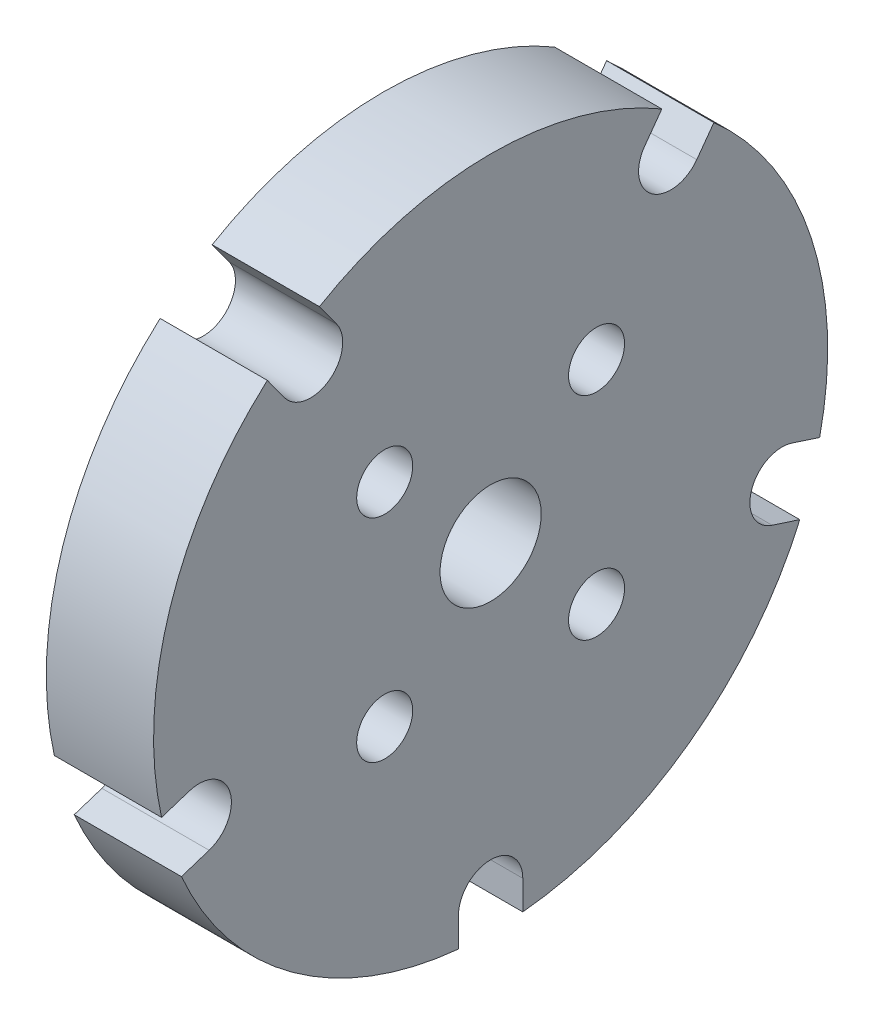
ISO-10303-21;
HEADER;
FILE_DESCRIPTION(('STEP AP214'),'2;1');
FILE_NAME('part.step','',(''),(''),'','','');
FILE_SCHEMA(('AUTOMOTIVE_DESIGN { 1 0 10303 214 1 1 1 1 }'));
ENDSEC;
DATA;
#1=APPLICATION_CONTEXT('core data for automotive mechanical design processes');
#2=APPLICATION_PROTOCOL_DEFINITION('international standard','automotive_design',2000,#1);
#3=PRODUCT_CONTEXT('',#1,'mechanical');
#4=PRODUCT('Part','Part','',(#3));
#5=PRODUCT_RELATED_PRODUCT_CATEGORY('part','',(#4));
#6=PRODUCT_DEFINITION_FORMATION('','',#4);
#7=PRODUCT_DEFINITION_CONTEXT('part definition',#1,'design');
#8=PRODUCT_DEFINITION('design','',#6,#7);
#9=PRODUCT_DEFINITION_SHAPE('','',#8);
#10=(LENGTH_UNIT() NAMED_UNIT(*) SI_UNIT(.MILLI.,.METRE.));
#11=(NAMED_UNIT(*) PLANE_ANGLE_UNIT() SI_UNIT($,.RADIAN.));
#12=(NAMED_UNIT(*) SI_UNIT($,.STERADIAN.) SOLID_ANGLE_UNIT());
#13=UNCERTAINTY_MEASURE_WITH_UNIT(LENGTH_MEASURE(1.E-05),#10,'distance_accuracy_value','');
#14=(GEOMETRIC_REPRESENTATION_CONTEXT(3) GLOBAL_UNCERTAINTY_ASSIGNED_CONTEXT((#13)) GLOBAL_UNIT_ASSIGNED_CONTEXT((#10,
#11,#12)) REPRESENTATION_CONTEXT('',''));
#15=CARTESIAN_POINT('',(0.,0.,0.));
#16=DIRECTION('',(0.,0.,1.));
#17=DIRECTION('',(1.,0.,0.));
#18=AXIS2_PLACEMENT_3D('',#15,#16,#17);
#19=CARTESIAN_POINT('',(7.,0.,0.));
#20=DIRECTION('',(-1.,0.,0.));
#21=DIRECTION('',(0.,0.,1.));
#22=AXIS2_PLACEMENT_3D('',#19,#20,#21);
#23=CYLINDRICAL_SURFACE('',#22,22.);
#24=CARTESIAN_POINT('',(7.,0.,0.));
#25=DIRECTION('',(1.,0.,0.));
#26=DIRECTION('',(0.,0.,-1.));
#27=AXIS2_PLACEMENT_3D('',#24,#25,#26);
#28=CIRCLE('',#27,22.);
#29=CARTESIAN_POINT('',(7.,-4.77011238747001,-21.476639118142));
#30=VERTEX_POINT('',#29);
#31=CARTESIAN_POINT('',(7.,16.4827537289933,-14.571164315502));
#32=VERTEX_POINT('',#31);
#33=EDGE_CURVE('E42',#30,#32,#28,.T.);
#34=ORIENTED_EDGE('',*,*,#33,.F.);
#35=DIRECTION('',(-1.,0.,0.));
#36=VECTOR('',#35,1.);
#37=CARTESIAN_POINT('',(7.,-4.77011238747001,-21.476639118142));
#38=LINE('',#37,#36);
#39=CARTESIAN_POINT('',(0.,-4.77011238747001,-21.476639118142));
#40=VERTEX_POINT('',#39);
#41=EDGE_CURVE('E191',#40,#30,#38,.F.);
#42=ORIENTED_EDGE('',*,*,#41,.F.);
#43=CARTESIAN_POINT('',(0.,0.,0.));
#44=DIRECTION('',(1.,0.,0.));
#45=DIRECTION('',(0.,0.,-1.));
#46=AXIS2_PLACEMENT_3D('',#43,#44,#45);
#47=CIRCLE('',#46,22.);
#48=CARTESIAN_POINT('',(0.,16.4827537289933,-14.571164315502));
#49=VERTEX_POINT('',#48);
#50=EDGE_CURVE('E228',#40,#49,#47,.T.);
#51=ORIENTED_EDGE('',*,*,#50,.T.);
#52=DIRECTION('',(-1.,0.,0.));
#53=VECTOR('',#52,1.);
#54=CARTESIAN_POINT('',(7.,16.4827537289933,-14.571164315502));
#55=LINE('',#54,#53);
#56=EDGE_CURVE('E253',#32,#49,#55,.T.);
#57=ORIENTED_EDGE('',*,*,#56,.F.);
#58=EDGE_LOOP('',(#34,#42,#51,#57));
#59=FACE_BOUND('',#58,.T.);
#60=ADVANCED_FACE('F33',(#59),#23,.T.);
#61=CARTESIAN_POINT('',(7.,18.9514517886216,-11.1732929391272));
#62=VERTEX_POINT('',#61);
#63=CARTESIAN_POINT('',(7.,18.9514517886215,11.1732929391275));
#64=VERTEX_POINT('',#63);
#65=EDGE_CURVE('E340',#62,#64,#28,.T.);
#66=ORIENTED_EDGE('',*,*,#65,.F.);
#67=DIRECTION('',(-1.,0.,0.));
#68=VECTOR('',#67,1.);
#69=CARTESIAN_POINT('',(7.,18.9514517886216,-11.1732929391272));
#70=LINE('',#69,#68);
#71=CARTESIAN_POINT('',(0.,18.9514517886217,-11.1732929391272));
#72=VERTEX_POINT('',#71);
#73=EDGE_CURVE('E242',#72,#62,#70,.F.);
#74=ORIENTED_EDGE('',*,*,#73,.F.);
#75=CARTESIAN_POINT('',(0.,18.9514517886215,11.1732929391275));
#76=VERTEX_POINT('',#75);
#77=EDGE_CURVE('E227',#72,#76,#47,.T.);
#78=ORIENTED_EDGE('',*,*,#77,.T.);
#79=DIRECTION('',(-1.,0.,0.));
#80=VECTOR('',#79,1.);
#81=CARTESIAN_POINT('',(7.,18.9514517886215,11.1732929391275));
#82=LINE('',#81,#80);
#83=EDGE_CURVE('E58',#64,#76,#82,.T.);
#84=ORIENTED_EDGE('',*,*,#83,.F.);
#85=EDGE_LOOP('',(#66,#74,#78,#84));
#86=FACE_BOUND('',#85,.T.);
#87=ADVANCED_FACE('F240',(#86),#23,.T.);
#88=CARTESIAN_POINT('',(7.,16.4827537289931,14.5711643155022));
#89=VERTEX_POINT('',#88);
#90=CARTESIAN_POINT('',(7.,-4.77011238747031,21.4766391181419));
#91=VERTEX_POINT('',#90);
#92=EDGE_CURVE('E229',#89,#91,#28,.T.);
#93=ORIENTED_EDGE('',*,*,#92,.F.);
#94=DIRECTION('',(-1.,0.,0.));
#95=VECTOR('',#94,1.);
#96=CARTESIAN_POINT('',(7.,16.4827537289931,14.5711643155022));
#97=LINE('',#96,#95);
#98=CARTESIAN_POINT('',(0.,16.4827537289931,14.5711643155022));
#99=VERTEX_POINT('',#98);
#100=EDGE_CURVE('E336',#99,#89,#97,.F.);
#101=ORIENTED_EDGE('',*,*,#100,.F.);
#102=CARTESIAN_POINT('',(0.,-4.77011238747031,21.4766391181419));
#103=VERTEX_POINT('',#102);
#104=EDGE_CURVE('E221',#99,#103,#47,.T.);
#105=ORIENTED_EDGE('',*,*,#104,.T.);
#106=DIRECTION('',(-1.,0.,0.));
#107=VECTOR('',#106,1.);
#108=CARTESIAN_POINT('',(7.,-4.77011238747031,21.4766391181419));
#109=LINE('',#108,#107);
#110=EDGE_CURVE('E50',#91,#103,#109,.T.);
#111=ORIENTED_EDGE('',*,*,#110,.F.);
#112=EDGE_LOOP('',(#93,#101,#105,#111));
#113=FACE_BOUND('',#112,.T.);
#114=ADVANCED_FACE('F318',(#113),#23,.T.);
#115=CARTESIAN_POINT('',(7.,-8.76454975590994,20.1787677417671));
#116=VERTEX_POINT('',#115);
#117=CARTESIAN_POINT('',(7.,-21.899543374235,2.1));
#118=VERTEX_POINT('',#117);
#119=EDGE_CURVE('E43',#116,#118,#28,.T.);
#120=ORIENTED_EDGE('',*,*,#119,.F.);
#121=DIRECTION('',(-1.,0.,0.));
#122=VECTOR('',#121,1.);
#123=CARTESIAN_POINT('',(7.,-8.76454975590994,20.1787677417671));
#124=LINE('',#123,#122);
#125=CARTESIAN_POINT('',(0.,-8.76454975590995,20.1787677417671));
#126=VERTEX_POINT('',#125);
#127=EDGE_CURVE('E262',#126,#116,#124,.F.);
#128=ORIENTED_EDGE('',*,*,#127,.F.);
#129=CARTESIAN_POINT('',(0.,-21.899543374235,2.1));
#130=VERTEX_POINT('',#129);
#131=EDGE_CURVE('E216',#126,#130,#47,.T.);
#132=ORIENTED_EDGE('',*,*,#131,.T.);
#133=DIRECTION('',(-1.,0.,0.));
#134=VECTOR('',#133,1.);
#135=CARTESIAN_POINT('',(7.,-21.899543374235,2.1));
#136=LINE('',#135,#134);
#137=EDGE_CURVE('E284',#118,#130,#136,.T.);
#138=ORIENTED_EDGE('',*,*,#137,.F.);
#139=EDGE_LOOP('',(#120,#128,#132,#138));
#140=FACE_BOUND('',#139,.T.);
#141=ADVANCED_FACE('F298',(#140),#23,.T.);
#142=CARTESIAN_POINT('',(0.,-21.899543374235,-2.1));
#143=VERTEX_POINT('',#142);
#144=CARTESIAN_POINT('',(0.,-8.76454975590966,-20.1787677417672));
#145=VERTEX_POINT('',#144);
#146=EDGE_CURVE('E37',#143,#145,#47,.T.);
#147=ORIENTED_EDGE('',*,*,#146,.T.);
#148=DIRECTION('',(-1.,0.,0.));
#149=VECTOR('',#148,1.);
#150=CARTESIAN_POINT('',(7.,-8.76454975590966,-20.1787677417672));
#151=LINE('',#150,#149);
#152=CARTESIAN_POINT('',(7.,-8.76454975590966,-20.1787677417672));
#153=VERTEX_POINT('',#152);
#154=EDGE_CURVE('E177',#153,#145,#151,.T.);
#155=ORIENTED_EDGE('',*,*,#154,.F.);
#156=CARTESIAN_POINT('',(7.,-21.899543374235,-2.1));
#157=VERTEX_POINT('',#156);
#158=EDGE_CURVE('E11',#157,#153,#28,.T.);
#159=ORIENTED_EDGE('',*,*,#158,.F.);
#160=DIRECTION('',(-1.,0.,0.));
#161=VECTOR('',#160,1.);
#162=CARTESIAN_POINT('',(7.,-21.899543374235,-2.1));
#163=LINE('',#162,#161);
#164=EDGE_CURVE('E286',#143,#157,#163,.F.);
#165=ORIENTED_EDGE('',*,*,#164,.F.);
#166=EDGE_LOOP('',(#147,#155,#159,#165));
#167=FACE_BOUND('',#166,.T.);
#168=ADVANCED_FACE('F35',(#167),#23,.T.);
#169=CARTESIAN_POINT('',(7.,0.,0.));
#170=DIRECTION('',(1.,0.,0.));
#171=DIRECTION('',(0.,0.,-1.));
#172=AXIS2_PLACEMENT_3D('',#169,#170,#171);
#173=PLANE('',#172);
#174=CARTESIAN_POINT('',(7.,6.91479721322325,-6.91479721322325));
#175=DIRECTION('',(-1.,0.,0.));
#176=DIRECTION('',(0.,0.,1.));
#177=AXIS2_PLACEMENT_3D('',#174,#175,#176);
#178=CIRCLE('',#177,1.8288);
#179=CARTESIAN_POINT('',(7.,6.91479721322325,-5.08599721322325));
#180=VERTEX_POINT('',#179);
#181=EDGE_CURVE('E484',#180,#180,#178,.T.);
#182=ORIENTED_EDGE('',*,*,#181,.T.);
#183=EDGE_LOOP('',(#182));
#184=FACE_BOUND('',#183,.T.);
#185=CARTESIAN_POINT('',(7.,6.91479721322325,6.91479721322325));
#186=DIRECTION('',(-1.,0.,0.));
#187=DIRECTION('',(0.,0.,1.));
#188=AXIS2_PLACEMENT_3D('',#185,#186,#187);
#189=CIRCLE('',#188,1.8288);
#190=CARTESIAN_POINT('',(7.,6.91479721322325,8.74359721322325));
#191=VERTEX_POINT('',#190);
#192=EDGE_CURVE('E496',#191,#191,#189,.T.);
#193=ORIENTED_EDGE('',*,*,#192,.T.);
#194=EDGE_LOOP('',(#193));
#195=FACE_BOUND('',#194,.T.);
#196=CARTESIAN_POINT('',(7.,-6.91479721322325,6.91479721322325));
#197=DIRECTION('',(-1.,0.,0.));
#198=DIRECTION('',(0.,0.,1.));
#199=AXIS2_PLACEMENT_3D('',#196,#197,#198);
#200=CIRCLE('',#199,1.8288);
#201=CARTESIAN_POINT('',(7.,-6.91479721322325,8.74359721322325));
#202=VERTEX_POINT('',#201);
#203=EDGE_CURVE('E508',#202,#202,#200,.T.);
#204=ORIENTED_EDGE('',*,*,#203,.T.);
#205=EDGE_LOOP('',(#204));
#206=FACE_BOUND('',#205,.T.);
#207=CARTESIAN_POINT('',(7.,-6.91479721322325,-6.91479721322325));
#208=DIRECTION('',(-1.,0.,0.));
#209=DIRECTION('',(0.,0.,1.));
#210=AXIS2_PLACEMENT_3D('',#207,#208,#209);
#211=CIRCLE('',#210,1.8288);
#212=CARTESIAN_POINT('',(7.,-6.91479721322325,-5.08599721322325));
#213=VERTEX_POINT('',#212);
#214=EDGE_CURVE('E520',#213,#213,#211,.T.);
#215=ORIENTED_EDGE('',*,*,#214,.T.);
#216=EDGE_LOOP('',(#215));
#217=FACE_BOUND('',#216,.T.);
#218=CARTESIAN_POINT('',(7.,0.,0.));
#219=DIRECTION('',(1.,0.,0.));
#220=DIRECTION('',(0.,0.,-1.));
#221=AXIS2_PLACEMENT_3D('',#218,#219,#220);
#222=CIRCLE('',#221,3.3);
#223=CARTESIAN_POINT('',(7.,0.,-3.3));
#224=VERTEX_POINT('',#223);
#225=EDGE_CURVE('E523',#224,#224,#222,.T.);
#226=ORIENTED_EDGE('',*,*,#225,.F.);
#227=EDGE_LOOP('',(#226));
#228=FACE_BOUND('',#227,.T.);
#229=DIRECTION('',(0.,0.309016994374944,0.951056516295155));
#230=VECTOR('',#229,1.);
#231=CARTESIAN_POINT('',(7.,-4.18312120327907,-19.6700660140905));
#232=LINE('',#231,#230);
#233=CARTESIAN_POINT('',(7.,-4.18312120327907,-19.6700660140905));
#234=VERTEX_POINT('',#233);
#235=EDGE_CURVE('E183',#30,#234,#232,.T.);
#236=ORIENTED_EDGE('',*,*,#235,.F.);
#237=ORIENTED_EDGE('',*,*,#33,.T.);
#238=DIRECTION('',(0.,0.809016994374951,-0.587785252292468));
#239=VECTOR('',#238,1.);
#240=CARTESIAN_POINT('',(7.,14.9459908576848,-13.4546407340368));
#241=LINE('',#240,#239);
#242=CARTESIAN_POINT('',(7.,14.9459908576848,-13.4546407340368));
#243=VERTEX_POINT('',#242);
#244=EDGE_CURVE('E346',#243,#32,#241,.T.);
#245=ORIENTED_EDGE('',*,*,#244,.F.);
#246=CARTESIAN_POINT('',(7.,16.180339887499,-11.7557050458494));
#247=DIRECTION('',(1.,0.,0.));
#248=DIRECTION('',(0.,0.587785252292469,0.809016994374951));
#249=AXIS2_PLACEMENT_3D('',#246,#247,#248);
#250=CIRCLE('',#249,2.1);
#251=CARTESIAN_POINT('',(7.,17.4146889173132,-10.056769357662));
#252=VERTEX_POINT('',#251);
#253=EDGE_CURVE('E543',#252,#243,#250,.T.);
#254=ORIENTED_EDGE('',*,*,#253,.F.);
#255=DIRECTION('',(0.,-0.809016994374951,0.587785252292468));
#256=VECTOR('',#255,1.);
#257=CARTESIAN_POINT('',(7.,17.4146889173132,-10.056769357662));
#258=LINE('',#257,#256);
#259=EDGE_CURVE('E547',#62,#252,#258,.T.);
#260=ORIENTED_EDGE('',*,*,#259,.F.);
#261=ORIENTED_EDGE('',*,*,#65,.T.);
#262=DIRECTION('',(0.,0.809016994374942,0.58778525229248));
#263=VECTOR('',#262,1.);
#264=CARTESIAN_POINT('',(7.,17.4146889173131,10.0567693576622));
#265=LINE('',#264,#263);
#266=CARTESIAN_POINT('',(7.,17.4146889173131,10.0567693576622));
#267=VERTEX_POINT('',#266);
#268=EDGE_CURVE('E369',#267,#64,#265,.T.);
#269=ORIENTED_EDGE('',*,*,#268,.F.);
#270=CARTESIAN_POINT('',(7.,16.1803398874988,11.7557050458496));
#271=DIRECTION('',(1.,0.,0.));
#272=DIRECTION('',(0.,-0.58778525229248,0.809016994374942));
#273=AXIS2_PLACEMENT_3D('',#270,#271,#272);
#274=CIRCLE('',#273,2.1);
#275=CARTESIAN_POINT('',(7.,14.9459908576846,13.454640734037));
#276=VERTEX_POINT('',#275);
#277=EDGE_CURVE('E366',#276,#267,#274,.T.);
#278=ORIENTED_EDGE('',*,*,#277,.F.);
#279=DIRECTION('',(0.,-0.809016994374942,-0.587785252292481));
#280=VECTOR('',#279,1.);
#281=CARTESIAN_POINT('',(7.,14.9459908576846,13.454640734037));
#282=LINE('',#281,#280);
#283=EDGE_CURVE('E371',#89,#276,#282,.T.);
#284=ORIENTED_EDGE('',*,*,#283,.F.);
#285=ORIENTED_EDGE('',*,*,#92,.T.);
#286=DIRECTION('',(0.,-0.309016994374958,0.95105651629515));
#287=VECTOR('',#286,1.);
#288=CARTESIAN_POINT('',(7.,-4.18312120327935,19.6700660140904));
#289=LINE('',#288,#287);
#290=CARTESIAN_POINT('',(7.,-4.18312120327935,19.6700660140904));
#291=VERTEX_POINT('',#290);
#292=EDGE_CURVE('E273',#291,#91,#289,.T.);
#293=ORIENTED_EDGE('',*,*,#292,.F.);
#294=CARTESIAN_POINT('',(7.,-6.18033988749916,19.021130325903));
#295=DIRECTION('',(1.,0.,0.));
#296=DIRECTION('',(0.,-0.95105651629515,-0.309016994374958));
#297=AXIS2_PLACEMENT_3D('',#294,#295,#296);
#298=CIRCLE('',#297,2.1);
#299=CARTESIAN_POINT('',(7.,-8.17755857171898,18.3721946377156));
#300=VERTEX_POINT('',#299);
#301=EDGE_CURVE('E270',#300,#291,#298,.T.);
#302=ORIENTED_EDGE('',*,*,#301,.F.);
#303=DIRECTION('',(0.,0.309016994374959,-0.95105651629515));
#304=VECTOR('',#303,1.);
#305=CARTESIAN_POINT('',(7.,-8.17755857171898,18.3721946377156));
#306=LINE('',#305,#304);
#307=EDGE_CURVE('E275',#116,#300,#306,.T.);
#308=ORIENTED_EDGE('',*,*,#307,.F.);
#309=ORIENTED_EDGE('',*,*,#119,.T.);
#310=DIRECTION('',(0.,-1.,0.));
#311=VECTOR('',#310,1.);
#312=CARTESIAN_POINT('',(7.,-20.,2.1));
#313=LINE('',#312,#311);
#314=CARTESIAN_POINT('',(7.,-20.,2.1));
#315=VERTEX_POINT('',#314);
#316=EDGE_CURVE('E205',#315,#118,#313,.T.);
#317=ORIENTED_EDGE('',*,*,#316,.F.);
#318=CARTESIAN_POINT('',(7.,-20.,0.));
#319=DIRECTION('',(1.,0.,0.));
#320=DIRECTION('',(0.,0.,-1.));
#321=AXIS2_PLACEMENT_3D('',#318,#319,#320);
#322=CIRCLE('',#321,2.1);
#323=CARTESIAN_POINT('',(7.,-20.,-2.1));
#324=VERTEX_POINT('',#323);
#325=EDGE_CURVE('E202',#324,#315,#322,.T.);
#326=ORIENTED_EDGE('',*,*,#325,.F.);
#327=DIRECTION('',(0.,1.,0.));
#328=VECTOR('',#327,1.);
#329=CARTESIAN_POINT('',(7.,-20.,-2.1));
#330=LINE('',#329,#328);
#331=EDGE_CURVE('E199',#157,#324,#330,.T.);
#332=ORIENTED_EDGE('',*,*,#331,.F.);
#333=ORIENTED_EDGE('',*,*,#158,.T.);
#334=DIRECTION('',(0.,-0.309016994374945,-0.951056516295155));
#335=VECTOR('',#334,1.);
#336=CARTESIAN_POINT('',(7.,-8.17755857171872,-18.3721946377157));
#337=LINE('',#336,#335);
#338=CARTESIAN_POINT('',(7.,-8.17755857171872,-18.3721946377157));
#339=VERTEX_POINT('',#338);
#340=EDGE_CURVE('E173',#339,#153,#337,.T.);
#341=ORIENTED_EDGE('',*,*,#340,.F.);
#342=CARTESIAN_POINT('',(7.,-6.1803398874989,-19.0211303259031));
#343=DIRECTION('',(1.,0.,0.));
#344=DIRECTION('',(0.,0.951056516295155,-0.309016994374945));
#345=AXIS2_PLACEMENT_3D('',#342,#343,#344);
#346=CIRCLE('',#345,2.1);
#347=EDGE_CURVE('E184',#234,#339,#346,.T.);
#348=ORIENTED_EDGE('',*,*,#347,.F.);
#349=EDGE_LOOP('',(#236,#237,#245,#254,#260,#261,#269,#278,#284,#285,#293,#302,#308,#309,#317,
#326,#332,#333,#341,#348));
#350=FACE_BOUND('',#349,.T.);
#351=ADVANCED_FACE('F196',(#184,#195,#206,#217,#228,#350),#173,.T.);
#352=CARTESIAN_POINT('',(0.,0.,0.));
#353=DIRECTION('',(1.,0.,0.));
#354=DIRECTION('',(0.,0.,-1.));
#355=AXIS2_PLACEMENT_3D('',#352,#353,#354);
#356=PLANE('',#355);
#357=CARTESIAN_POINT('',(0.,6.91479721322325,-6.91479721322325));
#358=DIRECTION('',(-1.,0.,0.));
#359=DIRECTION('',(0.,0.,1.));
#360=AXIS2_PLACEMENT_3D('',#357,#358,#359);
#361=CIRCLE('',#360,3.77063);
#362=CARTESIAN_POINT('',(0.,6.91479721322325,-3.14416721322325));
#363=VERTEX_POINT('',#362);
#364=EDGE_CURVE('E476',#363,#363,#361,.T.);
#365=ORIENTED_EDGE('',*,*,#364,.F.);
#366=EDGE_LOOP('',(#365));
#367=FACE_BOUND('',#366,.T.);
#368=CARTESIAN_POINT('',(0.,6.91479721322325,6.91479721322325));
#369=DIRECTION('',(-1.,0.,0.));
#370=DIRECTION('',(0.,0.,1.));
#371=AXIS2_PLACEMENT_3D('',#368,#369,#370);
#372=CIRCLE('',#371,3.77063);
#373=CARTESIAN_POINT('',(0.,6.91479721322325,10.6854272132232));
#374=VERTEX_POINT('',#373);
#375=EDGE_CURVE('E487',#374,#374,#372,.T.);
#376=ORIENTED_EDGE('',*,*,#375,.F.);
#377=EDGE_LOOP('',(#376));
#378=FACE_BOUND('',#377,.T.);
#379=CARTESIAN_POINT('',(0.,-6.91479721322325,6.91479721322325));
#380=DIRECTION('',(-1.,0.,0.));
#381=DIRECTION('',(0.,0.,1.));
#382=AXIS2_PLACEMENT_3D('',#379,#380,#381);
#383=CIRCLE('',#382,3.77063);
#384=CARTESIAN_POINT('',(0.,-6.91479721322325,10.6854272132232));
#385=VERTEX_POINT('',#384);
#386=EDGE_CURVE('E499',#385,#385,#383,.T.);
#387=ORIENTED_EDGE('',*,*,#386,.F.);
#388=EDGE_LOOP('',(#387));
#389=FACE_BOUND('',#388,.T.);
#390=CARTESIAN_POINT('',(0.,-6.91479721322325,-6.91479721322325));
#391=DIRECTION('',(-1.,0.,0.));
#392=DIRECTION('',(0.,0.,1.));
#393=AXIS2_PLACEMENT_3D('',#390,#391,#392);
#394=CIRCLE('',#393,3.77063);
#395=CARTESIAN_POINT('',(0.,-6.91479721322325,-3.14416721322325));
#396=VERTEX_POINT('',#395);
#397=EDGE_CURVE('E511',#396,#396,#394,.T.);
#398=ORIENTED_EDGE('',*,*,#397,.F.);
#399=EDGE_LOOP('',(#398));
#400=FACE_BOUND('',#399,.T.);
#401=CARTESIAN_POINT('',(0.,0.,0.));
#402=DIRECTION('',(1.,0.,0.));
#403=DIRECTION('',(0.,0.,-1.));
#404=AXIS2_PLACEMENT_3D('',#401,#402,#403);
#405=CIRCLE('',#404,3.3);
#406=CARTESIAN_POINT('',(0.,0.,-3.3));
#407=VERTEX_POINT('',#406);
#408=EDGE_CURVE('E263',#407,#407,#405,.F.);
#409=ORIENTED_EDGE('',*,*,#408,.F.);
#410=EDGE_LOOP('',(#409));
#411=FACE_BOUND('',#410,.T.);
#412=ORIENTED_EDGE('',*,*,#50,.F.);
#413=DIRECTION('',(0.,-0.309016994374944,-0.951056516295155));
#414=VECTOR('',#413,1.);
#415=CARTESIAN_POINT('',(0.,-4.18312120327907,-19.6700660140905));
#416=LINE('',#415,#414);
#417=CARTESIAN_POINT('',(0.,-4.18312120327907,-19.6700660140905));
#418=VERTEX_POINT('',#417);
#419=EDGE_CURVE('E532',#418,#40,#416,.T.);
#420=ORIENTED_EDGE('',*,*,#419,.F.);
#421=CARTESIAN_POINT('',(0.,-6.1803398874989,-19.0211303259031));
#422=DIRECTION('',(1.,0.,0.));
#423=DIRECTION('',(0.,0.,-1.));
#424=AXIS2_PLACEMENT_3D('',#421,#422,#423);
#425=CIRCLE('',#424,2.1);
#426=CARTESIAN_POINT('',(0.,-8.17755857171872,-18.3721946377157));
#427=VERTEX_POINT('',#426);
#428=EDGE_CURVE('E529',#427,#418,#425,.F.);
#429=ORIENTED_EDGE('',*,*,#428,.F.);
#430=DIRECTION('',(0.,0.309016994374945,0.951056516295155));
#431=VECTOR('',#430,1.);
#432=CARTESIAN_POINT('',(0.,-8.17755857171872,-18.3721946377157));
#433=LINE('',#432,#431);
#434=EDGE_CURVE('E287',#145,#427,#433,.T.);
#435=ORIENTED_EDGE('',*,*,#434,.F.);
#436=ORIENTED_EDGE('',*,*,#146,.F.);
#437=DIRECTION('',(0.,-1.,0.));
#438=VECTOR('',#437,1.);
#439=CARTESIAN_POINT('',(0.,-20.,-2.1));
#440=LINE('',#439,#438);
#441=CARTESIAN_POINT('',(0.,-20.,-2.1));
#442=VERTEX_POINT('',#441);
#443=EDGE_CURVE('E292',#442,#143,#440,.T.);
#444=ORIENTED_EDGE('',*,*,#443,.F.);
#445=CARTESIAN_POINT('',(0.,-20.,0.));
#446=DIRECTION('',(1.,0.,0.));
#447=DIRECTION('',(0.,0.,-1.));
#448=AXIS2_PLACEMENT_3D('',#445,#446,#447);
#449=CIRCLE('',#448,2.1);
#450=CARTESIAN_POINT('',(0.,-20.,2.1));
#451=VERTEX_POINT('',#450);
#452=EDGE_CURVE('E289',#451,#442,#449,.F.);
#453=ORIENTED_EDGE('',*,*,#452,.F.);
#454=DIRECTION('',(0.,1.,0.));
#455=VECTOR('',#454,1.);
#456=CARTESIAN_POINT('',(0.,-20.,2.1));
#457=LINE('',#456,#455);
#458=EDGE_CURVE('E213',#130,#451,#457,.T.);
#459=ORIENTED_EDGE('',*,*,#458,.F.);
#460=ORIENTED_EDGE('',*,*,#131,.F.);
#461=DIRECTION('',(0.,-0.309016994374959,0.95105651629515));
#462=VECTOR('',#461,1.);
#463=CARTESIAN_POINT('',(0.,-8.17755857171898,18.3721946377156));
#464=LINE('',#463,#462);
#465=CARTESIAN_POINT('',(0.,-8.17755857171898,18.3721946377156));
#466=VERTEX_POINT('',#465);
#467=EDGE_CURVE('E268',#466,#126,#464,.T.);
#468=ORIENTED_EDGE('',*,*,#467,.F.);
#469=CARTESIAN_POINT('',(0.,-6.18033988749916,19.021130325903));
#470=DIRECTION('',(1.,0.,0.));
#471=DIRECTION('',(0.,0.,-1.));
#472=AXIS2_PLACEMENT_3D('',#469,#470,#471);
#473=CIRCLE('',#472,2.1);
#474=CARTESIAN_POINT('',(0.,-4.18312120327935,19.6700660140904));
#475=VERTEX_POINT('',#474);
#476=EDGE_CURVE('E265',#475,#466,#473,.F.);
#477=ORIENTED_EDGE('',*,*,#476,.F.);
#478=DIRECTION('',(0.,0.309016994374958,-0.95105651629515));
#479=VECTOR('',#478,1.);
#480=CARTESIAN_POINT('',(0.,-4.18312120327935,19.6700660140904));
#481=LINE('',#480,#479);
#482=EDGE_CURVE('E281',#103,#475,#481,.T.);
#483=ORIENTED_EDGE('',*,*,#482,.F.);
#484=ORIENTED_EDGE('',*,*,#104,.F.);
#485=DIRECTION('',(0.,0.809016994374942,0.587785252292481));
#486=VECTOR('',#485,1.);
#487=CARTESIAN_POINT('',(0.,14.9459908576846,13.454640734037));
#488=LINE('',#487,#486);
#489=CARTESIAN_POINT('',(0.,14.9459908576846,13.454640734037));
#490=VERTEX_POINT('',#489);
#491=EDGE_CURVE('E364',#490,#99,#488,.T.);
#492=ORIENTED_EDGE('',*,*,#491,.F.);
#493=CARTESIAN_POINT('',(0.,16.1803398874988,11.7557050458496));
#494=DIRECTION('',(1.,0.,0.));
#495=DIRECTION('',(0.,0.,-1.));
#496=AXIS2_PLACEMENT_3D('',#493,#494,#495);
#497=CIRCLE('',#496,2.1);
#498=CARTESIAN_POINT('',(0.,17.4146889173131,10.0567693576622));
#499=VERTEX_POINT('',#498);
#500=EDGE_CURVE('E252',#499,#490,#497,.F.);
#501=ORIENTED_EDGE('',*,*,#500,.F.);
#502=DIRECTION('',(0.,-0.809016994374942,-0.58778525229248));
#503=VECTOR('',#502,1.);
#504=CARTESIAN_POINT('',(0.,17.4146889173131,10.0567693576622));
#505=LINE('',#504,#503);
#506=EDGE_CURVE('E249',#76,#499,#505,.T.);
#507=ORIENTED_EDGE('',*,*,#506,.F.);
#508=ORIENTED_EDGE('',*,*,#77,.F.);
#509=DIRECTION('',(0.,0.809016994374952,-0.587785252292468));
#510=VECTOR('',#509,1.);
#511=CARTESIAN_POINT('',(0.,17.4146889173132,-10.056769357662));
#512=LINE('',#511,#510);
#513=CARTESIAN_POINT('',(0.,17.4146889173132,-10.056769357662));
#514=VERTEX_POINT('',#513);
#515=EDGE_CURVE('E247',#514,#72,#512,.T.);
#516=ORIENTED_EDGE('',*,*,#515,.F.);
#517=CARTESIAN_POINT('',(0.,16.180339887499,-11.7557050458494));
#518=DIRECTION('',(1.,0.,0.));
#519=DIRECTION('',(0.,0.,-1.));
#520=AXIS2_PLACEMENT_3D('',#517,#518,#519);
#521=CIRCLE('',#520,2.1);
#522=CARTESIAN_POINT('',(0.,14.9459908576848,-13.4546407340368));
#523=VERTEX_POINT('',#522);
#524=EDGE_CURVE('E354',#523,#514,#521,.F.);
#525=ORIENTED_EDGE('',*,*,#524,.F.);
#526=DIRECTION('',(0.,-0.809016994374951,0.587785252292468));
#527=VECTOR('',#526,1.);
#528=CARTESIAN_POINT('',(0.,14.9459908576848,-13.4546407340368));
#529=LINE('',#528,#527);
#530=EDGE_CURVE('E192',#49,#523,#529,.T.);
#531=ORIENTED_EDGE('',*,*,#530,.F.);
#532=EDGE_LOOP('',(#412,#420,#429,#435,#436,#444,#453,#459,#460,#468,#477,#483,#484,#492,#501,
#507,#508,#516,#525,#531));
#533=FACE_BOUND('',#532,.T.);
#534=ADVANCED_FACE('F245',(#367,#378,#389,#400,#411,#533),#356,.F.);
#535=CARTESIAN_POINT('',(-0.00100000000000013,-20.,0.));
#536=DIRECTION('',(1.,0.,0.));
#537=DIRECTION('',(0.,0.,-1.));
#538=AXIS2_PLACEMENT_3D('',#535,#536,#537);
#539=CYLINDRICAL_SURFACE('',#538,2.1);
#540=ORIENTED_EDGE('',*,*,#452,.T.);
#541=DIRECTION('',(1.,0.,0.));
#542=VECTOR('',#541,1.);
#543=CARTESIAN_POINT('',(-0.00100000000000013,-20.,-2.1));
#544=LINE('',#543,#542);
#545=EDGE_CURVE('E207',#442,#324,#544,.T.);
#546=ORIENTED_EDGE('',*,*,#545,.T.);
#547=ORIENTED_EDGE('',*,*,#325,.T.);
#548=DIRECTION('',(1.,0.,0.));
#549=VECTOR('',#548,1.);
#550=CARTESIAN_POINT('',(-0.00100000000000013,-20.,2.1));
#551=LINE('',#550,#549);
#552=EDGE_CURVE('E204',#451,#315,#551,.T.);
#553=ORIENTED_EDGE('',*,*,#552,.F.);
#554=EDGE_LOOP('',(#540,#546,#547,#553));
#555=FACE_BOUND('',#554,.T.);
#556=ADVANCED_FACE('F294',(#555),#539,.F.);
#557=CARTESIAN_POINT('',(-0.00100000000000013,-20.,-2.1));
#558=DIRECTION('',(0.,0.,-1.));
#559=DIRECTION('',(0.,1.,0.));
#560=AXIS2_PLACEMENT_3D('',#557,#558,#559);
#561=PLANE('',#560);
#562=ORIENTED_EDGE('',*,*,#164,.T.);
#563=ORIENTED_EDGE('',*,*,#331,.T.);
#564=ORIENTED_EDGE('',*,*,#545,.F.);
#565=ORIENTED_EDGE('',*,*,#443,.T.);
#566=EDGE_LOOP('',(#562,#563,#564,#565));
#567=FACE_BOUND('',#566,.T.);
#568=ADVANCED_FACE('F303',(#567),#561,.F.);
#569=CARTESIAN_POINT('',(-0.00100000000000013,-20.,2.1));
#570=DIRECTION('',(0.,0.,1.));
#571=DIRECTION('',(0.,-1.,0.));
#572=AXIS2_PLACEMENT_3D('',#569,#570,#571);
#573=PLANE('',#572);
#574=ORIENTED_EDGE('',*,*,#137,.T.);
#575=ORIENTED_EDGE('',*,*,#458,.T.);
#576=ORIENTED_EDGE('',*,*,#552,.T.);
#577=ORIENTED_EDGE('',*,*,#316,.T.);
#578=EDGE_LOOP('',(#574,#575,#576,#577));
#579=FACE_BOUND('',#578,.T.);
#580=ADVANCED_FACE('F297',(#579),#573,.F.);
#581=CARTESIAN_POINT('',(-0.00100000000000013,-6.18033988749916,19.021130325903));
#582=DIRECTION('',(1.,0.,0.));
#583=DIRECTION('',(0.,0.,-1.));
#584=AXIS2_PLACEMENT_3D('',#581,#582,#583);
#585=CYLINDRICAL_SURFACE('',#584,2.1);
#586=ORIENTED_EDGE('',*,*,#476,.T.);
#587=DIRECTION('',(1.,0.,0.));
#588=VECTOR('',#587,1.);
#589=CARTESIAN_POINT('',(-0.00100000000000013,-8.17755857171898,18.3721946377156));
#590=LINE('',#589,#588);
#591=EDGE_CURVE('E279',#466,#300,#590,.T.);
#592=ORIENTED_EDGE('',*,*,#591,.T.);
#593=ORIENTED_EDGE('',*,*,#301,.T.);
#594=DIRECTION('',(1.,0.,0.));
#595=VECTOR('',#594,1.);
#596=CARTESIAN_POINT('',(-0.00100000000000013,-4.18312120327935,19.6700660140904));
#597=LINE('',#596,#595);
#598=EDGE_CURVE('E278',#475,#291,#597,.T.);
#599=ORIENTED_EDGE('',*,*,#598,.F.);
#600=EDGE_LOOP('',(#586,#592,#593,#599));
#601=FACE_BOUND('',#600,.T.);
#602=ADVANCED_FACE('F310',(#601),#585,.F.);
#603=CARTESIAN_POINT('',(-0.00100000000000013,-8.17755857171898,18.3721946377156));
#604=DIRECTION('',(0.,-0.95105651629515,-0.309016994374959));
#605=DIRECTION('',(0.,0.309016994374959,-0.95105651629515));
#606=AXIS2_PLACEMENT_3D('',#603,#604,#605);
#607=PLANE('',#606);
#608=ORIENTED_EDGE('',*,*,#127,.T.);
#609=ORIENTED_EDGE('',*,*,#307,.T.);
#610=ORIENTED_EDGE('',*,*,#591,.F.);
#611=ORIENTED_EDGE('',*,*,#467,.T.);
#612=EDGE_LOOP('',(#608,#609,#610,#611));
#613=FACE_BOUND('',#612,.T.);
#614=ADVANCED_FACE('F382',(#613),#607,.F.);
#615=CARTESIAN_POINT('',(-0.00100000000000013,-4.18312120327935,19.6700660140904));
#616=DIRECTION('',(0.,0.95105651629515,0.309016994374958));
#617=DIRECTION('',(0.,-0.309016994374958,0.95105651629515));
#618=AXIS2_PLACEMENT_3D('',#615,#616,#617);
#619=PLANE('',#618);
#620=ORIENTED_EDGE('',*,*,#110,.T.);
#621=ORIENTED_EDGE('',*,*,#482,.T.);
#622=ORIENTED_EDGE('',*,*,#598,.T.);
#623=ORIENTED_EDGE('',*,*,#292,.T.);
#624=EDGE_LOOP('',(#620,#621,#622,#623));
#625=FACE_BOUND('',#624,.T.);
#626=ADVANCED_FACE('F379',(#625),#619,.F.);
#627=CARTESIAN_POINT('',(-0.00100000000000013,16.1803398874988,11.7557050458496));
#628=DIRECTION('',(1.,0.,0.));
#629=DIRECTION('',(0.,0.,-1.));
#630=AXIS2_PLACEMENT_3D('',#627,#628,#629);
#631=CYLINDRICAL_SURFACE('',#630,2.1);
#632=ORIENTED_EDGE('',*,*,#500,.T.);
#633=DIRECTION('',(1.,0.,0.));
#634=VECTOR('',#633,1.);
#635=CARTESIAN_POINT('',(-0.00100000000000013,14.9459908576846,13.454640734037));
#636=LINE('',#635,#634);
#637=EDGE_CURVE('E254',#490,#276,#636,.T.);
#638=ORIENTED_EDGE('',*,*,#637,.T.);
#639=ORIENTED_EDGE('',*,*,#277,.T.);
#640=DIRECTION('',(1.,0.,0.));
#641=VECTOR('',#640,1.);
#642=CARTESIAN_POINT('',(-0.00100000000000013,17.4146889173131,10.0567693576622));
#643=LINE('',#642,#641);
#644=EDGE_CURVE('E257',#499,#267,#643,.T.);
#645=ORIENTED_EDGE('',*,*,#644,.F.);
#646=EDGE_LOOP('',(#632,#638,#639,#645));
#647=FACE_BOUND('',#646,.T.);
#648=ADVANCED_FACE('F377',(#647),#631,.F.);
#649=CARTESIAN_POINT('',(-0.00100000000000013,14.9459908576846,13.454640734037));
#650=DIRECTION('',(0.,-0.587785252292481,0.809016994374942));
#651=DIRECTION('',(0.,-0.809016994374942,-0.587785252292481));
#652=AXIS2_PLACEMENT_3D('',#649,#650,#651);
#653=PLANE('',#652);
#654=ORIENTED_EDGE('',*,*,#100,.T.);
#655=ORIENTED_EDGE('',*,*,#283,.T.);
#656=ORIENTED_EDGE('',*,*,#637,.F.);
#657=ORIENTED_EDGE('',*,*,#491,.T.);
#658=EDGE_LOOP('',(#654,#655,#656,#657));
#659=FACE_BOUND('',#658,.T.);
#660=ADVANCED_FACE('F378',(#659),#653,.F.);
#661=CARTESIAN_POINT('',(-0.00100000000000013,17.4146889173131,10.0567693576622));
#662=DIRECTION('',(0.,0.58778525229248,-0.809016994374942));
#663=DIRECTION('',(0.,0.809016994374942,0.58778525229248));
#664=AXIS2_PLACEMENT_3D('',#661,#662,#663);
#665=PLANE('',#664);
#666=ORIENTED_EDGE('',*,*,#83,.T.);
#667=ORIENTED_EDGE('',*,*,#506,.T.);
#668=ORIENTED_EDGE('',*,*,#644,.T.);
#669=ORIENTED_EDGE('',*,*,#268,.T.);
#670=EDGE_LOOP('',(#666,#667,#668,#669));
#671=FACE_BOUND('',#670,.T.);
#672=ADVANCED_FACE('F375',(#671),#665,.F.);
#673=CARTESIAN_POINT('',(-0.00100000000000013,16.180339887499,-11.7557050458494));
#674=DIRECTION('',(1.,0.,0.));
#675=DIRECTION('',(0.,0.,-1.));
#676=AXIS2_PLACEMENT_3D('',#673,#674,#675);
#677=CYLINDRICAL_SURFACE('',#676,2.1);
#678=ORIENTED_EDGE('',*,*,#524,.T.);
#679=DIRECTION('',(1.,0.,0.));
#680=VECTOR('',#679,1.);
#681=CARTESIAN_POINT('',(-0.00100000000000013,17.4146889173132,-10.056769357662));
#682=LINE('',#681,#680);
#683=EDGE_CURVE('E355',#514,#252,#682,.T.);
#684=ORIENTED_EDGE('',*,*,#683,.T.);
#685=ORIENTED_EDGE('',*,*,#253,.T.);
#686=DIRECTION('',(1.,0.,0.));
#687=VECTOR('',#686,1.);
#688=CARTESIAN_POINT('',(-0.00100000000000013,14.9459908576848,-13.4546407340368));
#689=LINE('',#688,#687);
#690=EDGE_CURVE('E357',#523,#243,#689,.T.);
#691=ORIENTED_EDGE('',*,*,#690,.F.);
#692=EDGE_LOOP('',(#678,#684,#685,#691));
#693=FACE_BOUND('',#692,.T.);
#694=ADVANCED_FACE('F395',(#693),#677,.F.);
#695=CARTESIAN_POINT('',(-0.00100000000000013,17.4146889173132,-10.056769357662));
#696=DIRECTION('',(0.,0.587785252292468,0.809016994374951));
#697=DIRECTION('',(0.,-0.809016994374952,0.587785252292468));
#698=AXIS2_PLACEMENT_3D('',#695,#696,#697);
#699=PLANE('',#698);
#700=ORIENTED_EDGE('',*,*,#73,.T.);
#701=ORIENTED_EDGE('',*,*,#259,.T.);
#702=ORIENTED_EDGE('',*,*,#683,.F.);
#703=ORIENTED_EDGE('',*,*,#515,.T.);
#704=EDGE_LOOP('',(#700,#701,#702,#703));
#705=FACE_BOUND('',#704,.T.);
#706=ADVANCED_FACE('F400',(#705),#699,.F.);
#707=CARTESIAN_POINT('',(-0.00100000000000013,14.9459908576848,-13.4546407340368));
#708=DIRECTION('',(0.,-0.587785252292468,-0.809016994374951));
#709=DIRECTION('',(0.,0.809016994374951,-0.587785252292468));
#710=AXIS2_PLACEMENT_3D('',#707,#708,#709);
#711=PLANE('',#710);
#712=ORIENTED_EDGE('',*,*,#56,.T.);
#713=ORIENTED_EDGE('',*,*,#530,.T.);
#714=ORIENTED_EDGE('',*,*,#690,.T.);
#715=ORIENTED_EDGE('',*,*,#244,.T.);
#716=EDGE_LOOP('',(#712,#713,#714,#715));
#717=FACE_BOUND('',#716,.T.);
#718=ADVANCED_FACE('F351',(#717),#711,.F.);
#719=CARTESIAN_POINT('',(-0.00100000000000013,-6.1803398874989,-19.0211303259031));
#720=DIRECTION('',(1.,0.,0.));
#721=DIRECTION('',(0.,0.,-1.));
#722=AXIS2_PLACEMENT_3D('',#719,#720,#721);
#723=CYLINDRICAL_SURFACE('',#722,2.1);
#724=ORIENTED_EDGE('',*,*,#428,.T.);
#725=DIRECTION('',(1.,0.,0.));
#726=VECTOR('',#725,1.);
#727=CARTESIAN_POINT('',(-0.00100000000000013,-4.18312120327907,-19.6700660140905));
#728=LINE('',#727,#726);
#729=EDGE_CURVE('E536',#418,#234,#728,.T.);
#730=ORIENTED_EDGE('',*,*,#729,.T.);
#731=ORIENTED_EDGE('',*,*,#347,.T.);
#732=DIRECTION('',(1.,0.,0.));
#733=VECTOR('',#732,1.);
#734=CARTESIAN_POINT('',(-0.00100000000000013,-8.17755857171872,-18.3721946377157));
#735=LINE('',#734,#733);
#736=EDGE_CURVE('E179',#427,#339,#735,.T.);
#737=ORIENTED_EDGE('',*,*,#736,.F.);
#738=EDGE_LOOP('',(#724,#730,#731,#737));
#739=FACE_BOUND('',#738,.T.);
#740=ADVANCED_FACE('F404',(#739),#723,.F.);
#741=CARTESIAN_POINT('',(-0.00100000000000013,-4.18312120327907,-19.6700660140905));
#742=DIRECTION('',(0.,0.951056516295155,-0.309016994374944));
#743=DIRECTION('',(0.,0.309016994374944,0.951056516295155));
#744=AXIS2_PLACEMENT_3D('',#741,#742,#743);
#745=PLANE('',#744);
#746=ORIENTED_EDGE('',*,*,#41,.T.);
#747=ORIENTED_EDGE('',*,*,#235,.T.);
#748=ORIENTED_EDGE('',*,*,#729,.F.);
#749=ORIENTED_EDGE('',*,*,#419,.T.);
#750=EDGE_LOOP('',(#746,#747,#748,#749));
#751=FACE_BOUND('',#750,.T.);
#752=ADVANCED_FACE('F410',(#751),#745,.F.);
#753=CARTESIAN_POINT('',(-0.00100000000000013,-8.17755857171872,-18.3721946377157));
#754=DIRECTION('',(0.,-0.951056516295155,0.309016994374945));
#755=DIRECTION('',(0.,-0.309016994374945,-0.951056516295155));
#756=AXIS2_PLACEMENT_3D('',#753,#754,#755);
#757=PLANE('',#756);
#758=ORIENTED_EDGE('',*,*,#154,.T.);
#759=ORIENTED_EDGE('',*,*,#434,.T.);
#760=ORIENTED_EDGE('',*,*,#736,.T.);
#761=ORIENTED_EDGE('',*,*,#340,.T.);
#762=EDGE_LOOP('',(#758,#759,#760,#761));
#763=FACE_BOUND('',#762,.T.);
#764=ADVANCED_FACE('F175',(#763),#757,.F.);
#765=CARTESIAN_POINT('',(-0.00100000000000013,0.,0.));
#766=DIRECTION('',(1.,0.,0.));
#767=DIRECTION('',(0.,0.,-1.));
#768=AXIS2_PLACEMENT_3D('',#765,#766,#767);
#769=CYLINDRICAL_SURFACE('',#768,3.3);
#770=ORIENTED_EDGE('',*,*,#225,.T.);
#771=EDGE_LOOP('',(#770));
#772=FACE_BOUND('',#771,.T.);
#773=ORIENTED_EDGE('',*,*,#408,.T.);
#774=EDGE_LOOP('',(#773));
#775=FACE_BOUND('',#774,.T.);
#776=ADVANCED_FACE('F414',(#772,#775),#769,.F.);
#777=CARTESIAN_POINT('',(0.,-6.91479721322325,-6.91479721322325));
#778=DIRECTION('',(-1.,0.,0.));
#779=DIRECTION('',(0.,0.,1.));
#780=AXIS2_PLACEMENT_3D('',#777,#778,#779);
#781=CYLINDRICAL_SURFACE('',#780,1.8288);
#782=ORIENTED_EDGE('',*,*,#214,.F.);
#783=EDGE_LOOP('',(#782));
#784=FACE_BOUND('',#783,.T.);
#785=CARTESIAN_POINT('',(2.4638,-6.91479721322325,-6.91479721322325));
#786=DIRECTION('',(-1.,0.,0.));
#787=DIRECTION('',(0.,0.,1.));
#788=AXIS2_PLACEMENT_3D('',#785,#786,#787);
#789=CIRCLE('',#788,1.8288);
#790=CARTESIAN_POINT('',(2.4638,-6.91479721322325,-5.08599721322325));
#791=VERTEX_POINT('',#790);
#792=EDGE_CURVE('E517',#791,#791,#789,.T.);
#793=ORIENTED_EDGE('',*,*,#792,.T.);
#794=EDGE_LOOP('',(#793));
#795=FACE_BOUND('',#794,.T.);
#796=ADVANCED_FACE('F420',(#784,#795),#781,.F.);
#797=CARTESIAN_POINT('',(2.4638,-5.08599721322325,-6.91479721322325));
#798=DIRECTION('',(1.,0.,0.));
#799=DIRECTION('',(0.,0.,-1.));
#800=AXIS2_PLACEMENT_3D('',#797,#798,#799);
#801=PLANE('',#800);
#802=ORIENTED_EDGE('',*,*,#792,.F.);
#803=EDGE_LOOP('',(#802));
#804=FACE_BOUND('',#803,.T.);
#805=CARTESIAN_POINT('',(2.4638,-6.91479721322325,-6.91479721322325));
#806=DIRECTION('',(-1.,0.,0.));
#807=DIRECTION('',(0.,0.,1.));
#808=AXIS2_PLACEMENT_3D('',#805,#806,#807);
#809=CIRCLE('',#808,3.77063);
#810=CARTESIAN_POINT('',(2.4638,-6.91479721322325,-3.14416721322325));
#811=VERTEX_POINT('',#810);
#812=EDGE_CURVE('E514',#811,#811,#809,.T.);
#813=ORIENTED_EDGE('',*,*,#812,.T.);
#814=EDGE_LOOP('',(#813));
#815=FACE_BOUND('',#814,.T.);
#816=ADVANCED_FACE('F424',(#804,#815),#801,.F.);
#817=CARTESIAN_POINT('',(0.,-6.91479721322325,-6.91479721322325));
#818=DIRECTION('',(-1.,0.,0.));
#819=DIRECTION('',(0.,0.,1.));
#820=AXIS2_PLACEMENT_3D('',#817,#818,#819);
#821=CYLINDRICAL_SURFACE('',#820,3.77063);
#822=ORIENTED_EDGE('',*,*,#812,.F.);
#823=EDGE_LOOP('',(#822));
#824=FACE_BOUND('',#823,.T.);
#825=ORIENTED_EDGE('',*,*,#397,.T.);
#826=EDGE_LOOP('',(#825));
#827=FACE_BOUND('',#826,.T.);
#828=ADVANCED_FACE('F428',(#824,#827),#821,.F.);
#829=CARTESIAN_POINT('',(0.,-6.91479721322325,6.91479721322325));
#830=DIRECTION('',(-1.,0.,0.));
#831=DIRECTION('',(0.,0.,1.));
#832=AXIS2_PLACEMENT_3D('',#829,#830,#831);
#833=CYLINDRICAL_SURFACE('',#832,1.8288);
#834=ORIENTED_EDGE('',*,*,#203,.F.);
#835=EDGE_LOOP('',(#834));
#836=FACE_BOUND('',#835,.T.);
#837=CARTESIAN_POINT('',(2.4638,-6.91479721322325,6.91479721322325));
#838=DIRECTION('',(-1.,0.,0.));
#839=DIRECTION('',(0.,0.,1.));
#840=AXIS2_PLACEMENT_3D('',#837,#838,#839);
#841=CIRCLE('',#840,1.8288);
#842=CARTESIAN_POINT('',(2.4638,-6.91479721322325,8.74359721322325));
#843=VERTEX_POINT('',#842);
#844=EDGE_CURVE('E505',#843,#843,#841,.T.);
#845=ORIENTED_EDGE('',*,*,#844,.T.);
#846=EDGE_LOOP('',(#845));
#847=FACE_BOUND('',#846,.T.);
#848=ADVANCED_FACE('F432',(#836,#847),#833,.F.);
#849=CARTESIAN_POINT('',(2.4638,-5.08599721322325,6.91479721322325));
#850=DIRECTION('',(1.,0.,0.));
#851=DIRECTION('',(0.,0.,-1.));
#852=AXIS2_PLACEMENT_3D('',#849,#850,#851);
#853=PLANE('',#852);
#854=ORIENTED_EDGE('',*,*,#844,.F.);
#855=EDGE_LOOP('',(#854));
#856=FACE_BOUND('',#855,.T.);
#857=CARTESIAN_POINT('',(2.4638,-6.91479721322325,6.91479721322325));
#858=DIRECTION('',(-1.,0.,0.));
#859=DIRECTION('',(0.,0.,1.));
#860=AXIS2_PLACEMENT_3D('',#857,#858,#859);
#861=CIRCLE('',#860,3.77063);
#862=CARTESIAN_POINT('',(2.4638,-6.91479721322325,10.6854272132232));
#863=VERTEX_POINT('',#862);
#864=EDGE_CURVE('E502',#863,#863,#861,.T.);
#865=ORIENTED_EDGE('',*,*,#864,.T.);
#866=EDGE_LOOP('',(#865));
#867=FACE_BOUND('',#866,.T.);
#868=ADVANCED_FACE('F436',(#856,#867),#853,.F.);
#869=CARTESIAN_POINT('',(0.,-6.91479721322325,6.91479721322325));
#870=DIRECTION('',(-1.,0.,0.));
#871=DIRECTION('',(0.,0.,1.));
#872=AXIS2_PLACEMENT_3D('',#869,#870,#871);
#873=CYLINDRICAL_SURFACE('',#872,3.77063);
#874=ORIENTED_EDGE('',*,*,#864,.F.);
#875=EDGE_LOOP('',(#874));
#876=FACE_BOUND('',#875,.T.);
#877=ORIENTED_EDGE('',*,*,#386,.T.);
#878=EDGE_LOOP('',(#877));
#879=FACE_BOUND('',#878,.T.);
#880=ADVANCED_FACE('F440',(#876,#879),#873,.F.);
#881=CARTESIAN_POINT('',(0.,6.91479721322325,6.91479721322325));
#882=DIRECTION('',(-1.,0.,0.));
#883=DIRECTION('',(0.,0.,1.));
#884=AXIS2_PLACEMENT_3D('',#881,#882,#883);
#885=CYLINDRICAL_SURFACE('',#884,1.8288);
#886=ORIENTED_EDGE('',*,*,#192,.F.);
#887=EDGE_LOOP('',(#886));
#888=FACE_BOUND('',#887,.T.);
#889=CARTESIAN_POINT('',(2.4638,6.91479721322325,6.91479721322325));
#890=DIRECTION('',(-1.,0.,0.));
#891=DIRECTION('',(0.,0.,1.));
#892=AXIS2_PLACEMENT_3D('',#889,#890,#891);
#893=CIRCLE('',#892,1.8288);
#894=CARTESIAN_POINT('',(2.4638,6.91479721322325,8.74359721322325));
#895=VERTEX_POINT('',#894);
#896=EDGE_CURVE('E493',#895,#895,#893,.T.);
#897=ORIENTED_EDGE('',*,*,#896,.T.);
#898=EDGE_LOOP('',(#897));
#899=FACE_BOUND('',#898,.T.);
#900=ADVANCED_FACE('F444',(#888,#899),#885,.F.);
#901=CARTESIAN_POINT('',(2.4638,8.74359721322325,6.91479721322325));
#902=DIRECTION('',(1.,0.,0.));
#903=DIRECTION('',(0.,0.,-1.));
#904=AXIS2_PLACEMENT_3D('',#901,#902,#903);
#905=PLANE('',#904);
#906=ORIENTED_EDGE('',*,*,#896,.F.);
#907=EDGE_LOOP('',(#906));
#908=FACE_BOUND('',#907,.T.);
#909=CARTESIAN_POINT('',(2.4638,6.91479721322325,6.91479721322325));
#910=DIRECTION('',(-1.,0.,0.));
#911=DIRECTION('',(0.,0.,1.));
#912=AXIS2_PLACEMENT_3D('',#909,#910,#911);
#913=CIRCLE('',#912,3.77063);
#914=CARTESIAN_POINT('',(2.4638,6.91479721322325,10.6854272132232));
#915=VERTEX_POINT('',#914);
#916=EDGE_CURVE('E490',#915,#915,#913,.T.);
#917=ORIENTED_EDGE('',*,*,#916,.T.);
#918=EDGE_LOOP('',(#917));
#919=FACE_BOUND('',#918,.T.);
#920=ADVANCED_FACE('F448',(#908,#919),#905,.F.);
#921=CARTESIAN_POINT('',(0.,6.91479721322325,6.91479721322325));
#922=DIRECTION('',(-1.,0.,0.));
#923=DIRECTION('',(0.,0.,1.));
#924=AXIS2_PLACEMENT_3D('',#921,#922,#923);
#925=CYLINDRICAL_SURFACE('',#924,3.77063);
#926=ORIENTED_EDGE('',*,*,#916,.F.);
#927=EDGE_LOOP('',(#926));
#928=FACE_BOUND('',#927,.T.);
#929=ORIENTED_EDGE('',*,*,#375,.T.);
#930=EDGE_LOOP('',(#929));
#931=FACE_BOUND('',#930,.T.);
#932=ADVANCED_FACE('F452',(#928,#931),#925,.F.);
#933=CARTESIAN_POINT('',(0.,6.91479721322325,-6.91479721322325));
#934=DIRECTION('',(-1.,0.,0.));
#935=DIRECTION('',(0.,0.,1.));
#936=AXIS2_PLACEMENT_3D('',#933,#934,#935);
#937=CYLINDRICAL_SURFACE('',#936,1.8288);
#938=ORIENTED_EDGE('',*,*,#181,.F.);
#939=EDGE_LOOP('',(#938));
#940=FACE_BOUND('',#939,.T.);
#941=CARTESIAN_POINT('',(2.4638,6.91479721322325,-6.91479721322325));
#942=DIRECTION('',(-1.,0.,0.));
#943=DIRECTION('',(0.,0.,1.));
#944=AXIS2_PLACEMENT_3D('',#941,#942,#943);
#945=CIRCLE('',#944,1.8288);
#946=CARTESIAN_POINT('',(2.4638,6.91479721322325,-5.08599721322325));
#947=VERTEX_POINT('',#946);
#948=EDGE_CURVE('E479',#947,#947,#945,.T.);
#949=ORIENTED_EDGE('',*,*,#948,.T.);
#950=EDGE_LOOP('',(#949));
#951=FACE_BOUND('',#950,.T.);
#952=ADVANCED_FACE('F456',(#940,#951),#937,.F.);
#953=CARTESIAN_POINT('',(2.4638,8.74359721322325,-6.91479721322325));
#954=DIRECTION('',(1.,0.,0.));
#955=DIRECTION('',(0.,0.,-1.));
#956=AXIS2_PLACEMENT_3D('',#953,#954,#955);
#957=PLANE('',#956);
#958=ORIENTED_EDGE('',*,*,#948,.F.);
#959=EDGE_LOOP('',(#958));
#960=FACE_BOUND('',#959,.T.);
#961=CARTESIAN_POINT('',(2.4638,6.91479721322325,-6.91479721322325));
#962=DIRECTION('',(-1.,0.,0.));
#963=DIRECTION('',(0.,0.,1.));
#964=AXIS2_PLACEMENT_3D('',#961,#962,#963);
#965=CIRCLE('',#964,3.77063);
#966=CARTESIAN_POINT('',(2.4638,6.91479721322325,-3.14416721322325));
#967=VERTEX_POINT('',#966);
#968=EDGE_CURVE('E473',#967,#967,#965,.T.);
#969=ORIENTED_EDGE('',*,*,#968,.T.);
#970=EDGE_LOOP('',(#969));
#971=FACE_BOUND('',#970,.T.);
#972=ADVANCED_FACE('F460',(#960,#971),#957,.F.);
#973=CARTESIAN_POINT('',(0.,6.91479721322325,-6.91479721322325));
#974=DIRECTION('',(-1.,0.,0.));
#975=DIRECTION('',(0.,0.,1.));
#976=AXIS2_PLACEMENT_3D('',#973,#974,#975);
#977=CYLINDRICAL_SURFACE('',#976,3.77063);
#978=ORIENTED_EDGE('',*,*,#968,.F.);
#979=EDGE_LOOP('',(#978));
#980=FACE_BOUND('',#979,.T.);
#981=ORIENTED_EDGE('',*,*,#364,.T.);
#982=EDGE_LOOP('',(#981));
#983=FACE_BOUND('',#982,.T.);
#984=ADVANCED_FACE('F464',(#980,#983),#977,.F.);
#985=CLOSED_SHELL('',(#60,#87,#114,#141,#168,#351,#534,#556,#568,#580,#602,#614,#626,#648,#660,
#672,#694,#706,#718,#740,#752,#764,#776,#796,#816,#828,#848,#868,#880,#900,#920,#932,#952,#972,#984));
#986=MANIFOLD_SOLID_BREP('B2',#985);
#987=ADVANCED_BREP_SHAPE_REPRESENTATION('',(#18,#986),#14);
#988=SHAPE_DEFINITION_REPRESENTATION(#9,#987);
ENDSEC;
END-ISO-10303-21;
